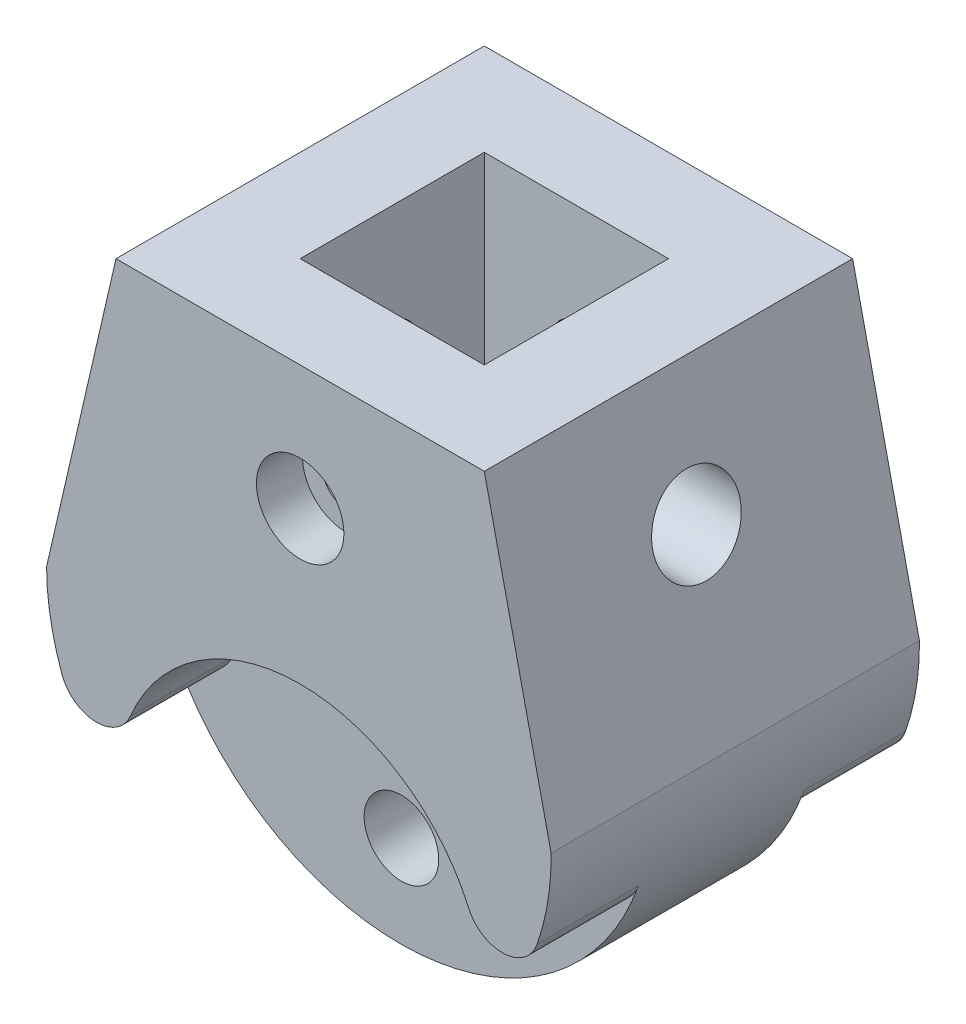
ISO-10303-21;
HEADER;
FILE_DESCRIPTION(('STEP AP214'),'2;1');
FILE_NAME('part.step','',(''),(''),'','','');
FILE_SCHEMA(('AUTOMOTIVE_DESIGN { 1 0 10303 214 1 1 1 1 }'));
ENDSEC;
DATA;
#1=APPLICATION_CONTEXT('core data for automotive mechanical design processes');
#2=APPLICATION_PROTOCOL_DEFINITION('international standard','automotive_design',2000,#1);
#3=PRODUCT_CONTEXT('',#1,'mechanical');
#4=PRODUCT('Part','Part','',(#3));
#5=PRODUCT_RELATED_PRODUCT_CATEGORY('part','',(#4));
#6=PRODUCT_DEFINITION_FORMATION('','',#4);
#7=PRODUCT_DEFINITION_CONTEXT('part definition',#1,'design');
#8=PRODUCT_DEFINITION('design','',#6,#7);
#9=PRODUCT_DEFINITION_SHAPE('','',#8);
#10=(LENGTH_UNIT() NAMED_UNIT(*) SI_UNIT(.MILLI.,.METRE.));
#11=(NAMED_UNIT(*) PLANE_ANGLE_UNIT() SI_UNIT($,.RADIAN.));
#12=(NAMED_UNIT(*) SI_UNIT($,.STERADIAN.) SOLID_ANGLE_UNIT());
#13=UNCERTAINTY_MEASURE_WITH_UNIT(LENGTH_MEASURE(1.E-05),#10,'distance_accuracy_value','');
#14=(GEOMETRIC_REPRESENTATION_CONTEXT(3) GLOBAL_UNCERTAINTY_ASSIGNED_CONTEXT((#13)) GLOBAL_UNIT_ASSIGNED_CONTEXT((#10,
#11,#12)) REPRESENTATION_CONTEXT('',''));
#15=CARTESIAN_POINT('',(0.,0.,0.));
#16=DIRECTION('',(0.,0.,1.));
#17=DIRECTION('',(1.,0.,0.));
#18=AXIS2_PLACEMENT_3D('',#15,#16,#17);
#19=CARTESIAN_POINT('',(-33.7452896286534,36.5,20.));
#20=DIRECTION('',(1.,0.,0.));
#21=DIRECTION('',(0.,0.,-1.));
#22=AXIS2_PLACEMENT_3D('',#19,#20,#21);
#23=CYLINDRICAL_SURFACE('',#22,2.55);
#24=CARTESIAN_POINT('',(-9.99999999999999,36.5,20.));
#25=DIRECTION('',(-1.,0.,0.));
#26=DIRECTION('',(0.,0.,1.));
#27=AXIS2_PLACEMENT_3D('',#24,#25,#26);
#28=CIRCLE('',#27,2.55);
#29=CARTESIAN_POINT('',(-10.,36.5,17.45));
#30=VERTEX_POINT('',#29);
#31=EDGE_CURVE('E354',#30,#30,#28,.T.);
#32=CARTESIAN_POINT('',(-15.540722099948,36.5,20.));
#33=DIRECTION('',(-1.,0.,0.));
#34=DIRECTION('',(0.,0.,1.));
#35=AXIS2_PLACEMENT_3D('',#32,#33,#34);
#36=CIRCLE('',#35,2.55);
#37=CARTESIAN_POINT('',(-15.540722099948,36.5,17.45));
#38=VERTEX_POINT('',#37);
#39=EDGE_CURVE('E368',#38,#38,#36,.F.);
#40=CARTESIAN_POINT('',(-10.,36.5,17.45));
#41=CARTESIAN_POINT('',(-10.0577158552078,36.5,17.45));
#42=CARTESIAN_POINT('',(-10.1154317104156,36.5,17.45));
#43=CARTESIAN_POINT('',(-10.2308634208312,36.5,17.45));
#44=CARTESIAN_POINT('',(-10.288579276039,36.5,17.45));
#45=CARTESIAN_POINT('',(-10.4040109864545,36.5,17.45));
#46=CARTESIAN_POINT('',(-10.4617268416623,36.5,17.45));
#47=CARTESIAN_POINT('',(-10.5771585520779,36.5,17.45));
#48=CARTESIAN_POINT('',(-10.6348744072857,36.5,17.45));
#49=CARTESIAN_POINT('',(-10.7503061177013,36.5,17.45));
#50=CARTESIAN_POINT('',(-10.8080219729091,36.5,17.45));
#51=CARTESIAN_POINT('',(-10.9234536833247,36.5,17.45));
#52=CARTESIAN_POINT('',(-10.9811695385325,36.5,17.45));
#53=CARTESIAN_POINT('',(-11.096601248948,36.5,17.45));
#54=CARTESIAN_POINT('',(-11.1543171041558,36.5,17.45));
#55=CARTESIAN_POINT('',(-11.2697488145714,36.5,17.45));
#56=CARTESIAN_POINT('',(-11.3274646697792,36.5,17.45));
#57=CARTESIAN_POINT('',(-11.4428963801948,36.5,17.45));
#58=CARTESIAN_POINT('',(-11.5006122354026,36.5,17.45));
#59=CARTESIAN_POINT('',(-11.6160439458182,36.5,17.45));
#60=CARTESIAN_POINT('',(-11.673759801026,36.5,17.45));
#61=CARTESIAN_POINT('',(-11.7891915114415,36.5,17.45));
#62=CARTESIAN_POINT('',(-11.8469073666493,36.5,17.45));
#63=CARTESIAN_POINT('',(-11.9623390770649,36.5,17.45));
#64=CARTESIAN_POINT('',(-12.0200549322727,36.5,17.45));
#65=CARTESIAN_POINT('',(-12.1354866426883,36.5,17.45));
#66=CARTESIAN_POINT('',(-12.1932024978961,36.5,17.45));
#67=CARTESIAN_POINT('',(-12.3086342083117,36.5,17.45));
#68=CARTESIAN_POINT('',(-12.3663500635195,36.5,17.45));
#69=CARTESIAN_POINT('',(-12.481781773935,36.5,17.45));
#70=CARTESIAN_POINT('',(-12.5394976291428,36.5,17.45));
#71=CARTESIAN_POINT('',(-12.6549293395584,36.5,17.45));
#72=CARTESIAN_POINT('',(-12.7126451947662,36.5,17.45));
#73=CARTESIAN_POINT('',(-12.8280769051818,36.5,17.45));
#74=CARTESIAN_POINT('',(-12.8857927603896,36.5,17.45));
#75=CARTESIAN_POINT('',(-13.0012244708052,36.5,17.45));
#76=CARTESIAN_POINT('',(-13.058940326013,36.5,17.45));
#77=CARTESIAN_POINT('',(-13.1743720364285,36.5,17.45));
#78=CARTESIAN_POINT('',(-13.2320878916363,36.5,17.45));
#79=CARTESIAN_POINT('',(-13.3475196020519,36.5,17.45));
#80=CARTESIAN_POINT('',(-13.4052354572597,36.5,17.45));
#81=CARTESIAN_POINT('',(-13.5206671676753,36.5,17.45));
#82=CARTESIAN_POINT('',(-13.5783830228831,36.5,17.45));
#83=CARTESIAN_POINT('',(-13.6938147332987,36.5,17.45));
#84=CARTESIAN_POINT('',(-13.7515305885065,36.5,17.45));
#85=CARTESIAN_POINT('',(-13.866962298922,36.5,17.45));
#86=CARTESIAN_POINT('',(-13.9246781541298,36.5,17.45));
#87=CARTESIAN_POINT('',(-14.0401098645454,36.5,17.45));
#88=CARTESIAN_POINT('',(-14.0978257197532,36.5,17.45));
#89=CARTESIAN_POINT('',(-14.2132574301688,36.5,17.45));
#90=CARTESIAN_POINT('',(-14.2709732853766,36.5,17.45));
#91=CARTESIAN_POINT('',(-14.3864049957922,36.5,17.45));
#92=CARTESIAN_POINT('',(-14.444120851,36.5,17.45));
#93=CARTESIAN_POINT('',(-14.5595525614155,36.5,17.45));
#94=CARTESIAN_POINT('',(-14.6172684166233,36.5,17.45));
#95=CARTESIAN_POINT('',(-14.7327001270389,36.5,17.45));
#96=CARTESIAN_POINT('',(-14.7904159822467,36.5,17.45));
#97=CARTESIAN_POINT('',(-14.9058476926623,36.5,17.45));
#98=CARTESIAN_POINT('',(-14.9635635478701,36.5,17.45));
#99=CARTESIAN_POINT('',(-15.0789952582857,36.5,17.45));
#100=CARTESIAN_POINT('',(-15.1367111134935,36.5,17.45));
#101=CARTESIAN_POINT('',(-15.252142823909,36.5,17.45));
#102=CARTESIAN_POINT('',(-15.3098586791168,36.5,17.45));
#103=CARTESIAN_POINT('',(-15.4252903895324,36.5,17.45));
#104=CARTESIAN_POINT('',(-15.4830062447402,36.5,17.45));
#105=CARTESIAN_POINT('',(-15.540722099948,36.5,17.45));
#106=B_SPLINE_CURVE_WITH_KNOTS('',3,(#40,#41,#42,#43,#44,#45,#46,#47,#48,#49,#50,#51,#52,#53,
#54,#55,#56,#57,#58,#59,#60,#61,#62,#63,#64,#65,#66,#67,#68,#69,#70,#71,#72,#73,#74,#75,#76,#77,
#78,#79,#80,#81,#82,#83,#84,#85,#86,#87,#88,#89,#90,#91,#92,#93,#94,#95,#96,#97,#98,#99,#100,
#101,#102,#103,#104,#105),.UNSPECIFIED.,.F.,.F.,(4,2,2,2,2,2,2,2,2,2,2,2,2,2,2,2,2,2,2,2,2,2,2,
2,2,2,2,2,2,2,2,2,4),(0.,0.173147565623376,0.346295131246749,0.519442696870126,
0.692590262493499,0.865737828116875,1.03888539374025,1.21203295936362,1.385180524987,
1.55832809061037,1.73147565623375,1.90462322185712,2.0777707874805,2.25091835310387,
2.42406591872725,2.59721348435062,2.770361049974,2.94350861559738,3.11665618122075,
3.28980374684413,3.4629513124675,3.63609887809088,3.80924644371425,3.98239400933762,
4.155541574961,4.32868914058437,4.50183670620775,4.67498427183112,4.8481318374545,
5.02127940307787,5.19442696870125,5.36757453432463,5.540722099948),.UNSPECIFIED.);
#107=EDGE_CURVE('BSEAM69',#30,#38,#106,.T.);
#108=ORIENTED_EDGE('',*,*,#31,.F.);
#109=ORIENTED_EDGE('',*,*,#39,.F.);
#110=ORIENTED_EDGE('',*,*,#107,.T.);
#111=ORIENTED_EDGE('',*,*,#107,.F.);
#112=EDGE_LOOP('',(#108,#110,#109,#111));
#113=FACE_BOUND('',#112,.T.);
#114=ADVANCED_FACE('F69',(#113),#23,.F.);
#115=CARTESIAN_POINT('',(10.,36.5,20.));
#116=DIRECTION('',(1.,0.,0.));
#117=DIRECTION('',(0.,0.,-1.));
#118=AXIS2_PLACEMENT_3D('',#115,#116,#117);
#119=CIRCLE('',#118,2.55);
#120=CARTESIAN_POINT('',(10.,36.5,17.45));
#121=VERTEX_POINT('',#120);
#122=EDGE_CURVE('E358',#121,#121,#119,.T.);
#123=CARTESIAN_POINT('',(15.2547103713466,36.5,20.));
#124=DIRECTION('',(1.,0.,0.));
#125=DIRECTION('',(0.,0.,-1.));
#126=AXIS2_PLACEMENT_3D('',#123,#124,#125);
#127=CIRCLE('',#126,2.55);
#128=CARTESIAN_POINT('',(15.2547103713466,36.5,17.45));
#129=VERTEX_POINT('',#128);
#130=EDGE_CURVE('E360',#129,#129,#127,.F.);
#131=CARTESIAN_POINT('',(10.,36.5,17.45));
#132=CARTESIAN_POINT('',(10.0547365663682,36.5,17.45));
#133=CARTESIAN_POINT('',(10.1094731327364,36.5,17.45));
#134=CARTESIAN_POINT('',(10.2189462654728,36.5,17.45));
#135=CARTESIAN_POINT('',(10.273682831841,36.5,17.45));
#136=CARTESIAN_POINT('',(10.3831559645774,36.5,17.45));
#137=CARTESIAN_POINT('',(10.4378925309456,36.5,17.45));
#138=CARTESIAN_POINT('',(10.5473656636819,36.5,17.45));
#139=CARTESIAN_POINT('',(10.6021022300501,36.5,17.45));
#140=CARTESIAN_POINT('',(10.7115753627865,36.5,17.45));
#141=CARTESIAN_POINT('',(10.7663119291547,36.5,17.45));
#142=CARTESIAN_POINT('',(10.8757850618911,36.5,17.45));
#143=CARTESIAN_POINT('',(10.9305216282593,36.5,17.45));
#144=CARTESIAN_POINT('',(11.0399947609957,36.5,17.45));
#145=CARTESIAN_POINT('',(11.0947313273639,36.5,17.45));
#146=CARTESIAN_POINT('',(11.2042044601003,36.5,17.45));
#147=CARTESIAN_POINT('',(11.2589410264685,36.5,17.45));
#148=CARTESIAN_POINT('',(11.3684141592049,36.5,17.45));
#149=CARTESIAN_POINT('',(11.423150725573,36.5,17.45));
#150=CARTESIAN_POINT('',(11.5326238583094,36.5,17.45));
#151=CARTESIAN_POINT('',(11.5873604246776,36.5,17.45));
#152=CARTESIAN_POINT('',(11.696833557414,36.5,17.45));
#153=CARTESIAN_POINT('',(11.7515701237822,36.5,17.45));
#154=CARTESIAN_POINT('',(11.8610432565186,36.5,17.45));
#155=CARTESIAN_POINT('',(11.9157798228868,36.5,17.45));
#156=CARTESIAN_POINT('',(12.0252529556232,36.5,17.45));
#157=CARTESIAN_POINT('',(12.0799895219914,36.5,17.45));
#158=CARTESIAN_POINT('',(12.1894626547278,36.5,17.45));
#159=CARTESIAN_POINT('',(12.244199221096,36.5,17.45));
#160=CARTESIAN_POINT('',(12.3536723538323,36.5,17.45));
#161=CARTESIAN_POINT('',(12.4084089202005,36.5,17.45));
#162=CARTESIAN_POINT('',(12.5178820529369,36.5,17.45));
#163=CARTESIAN_POINT('',(12.5726186193051,36.5,17.45));
#164=CARTESIAN_POINT('',(12.6820917520415,36.5,17.45));
#165=CARTESIAN_POINT('',(12.7368283184097,36.5,17.45));
#166=CARTESIAN_POINT('',(12.8463014511461,36.5,17.45));
#167=CARTESIAN_POINT('',(12.9010380175143,36.5,17.45));
#168=CARTESIAN_POINT('',(13.0105111502507,36.5,17.45));
#169=CARTESIAN_POINT('',(13.0652477166189,36.5,17.45));
#170=CARTESIAN_POINT('',(13.1747208493553,36.5,17.45));
#171=CARTESIAN_POINT('',(13.2294574157235,36.5,17.45));
#172=CARTESIAN_POINT('',(13.3389305484598,36.5,17.45));
#173=CARTESIAN_POINT('',(13.393667114828,36.5,17.45));
#174=CARTESIAN_POINT('',(13.5031402475644,36.5,17.45));
#175=CARTESIAN_POINT('',(13.5578768139326,36.5,17.45));
#176=CARTESIAN_POINT('',(13.667349946669,36.5,17.45));
#177=CARTESIAN_POINT('',(13.7220865130372,36.5,17.45));
#178=CARTESIAN_POINT('',(13.8315596457736,36.5,17.45));
#179=CARTESIAN_POINT('',(13.8862962121418,36.5,17.45));
#180=CARTESIAN_POINT('',(13.9957693448782,36.5,17.45));
#181=CARTESIAN_POINT('',(14.0505059112464,36.5,17.45));
#182=CARTESIAN_POINT('',(14.1599790439828,36.5,17.45));
#183=CARTESIAN_POINT('',(14.2147156103509,36.5,17.45));
#184=CARTESIAN_POINT('',(14.3241887430873,36.5,17.45));
#185=CARTESIAN_POINT('',(14.3789253094555,36.5,17.45));
#186=CARTESIAN_POINT('',(14.4883984421919,36.5,17.45));
#187=CARTESIAN_POINT('',(14.5431350085601,36.5,17.45));
#188=CARTESIAN_POINT('',(14.6526081412965,36.5,17.45));
#189=CARTESIAN_POINT('',(14.7073447076647,36.5,17.45));
#190=CARTESIAN_POINT('',(14.8168178404011,36.5,17.45));
#191=CARTESIAN_POINT('',(14.8715544067693,36.5,17.45));
#192=CARTESIAN_POINT('',(14.9810275395057,36.5,17.45));
#193=CARTESIAN_POINT('',(15.0357641058739,36.5,17.45));
#194=CARTESIAN_POINT('',(15.1452372386102,36.5,17.45));
#195=CARTESIAN_POINT('',(15.1999738049784,36.5,17.45));
#196=CARTESIAN_POINT('',(15.2547103713466,36.5,17.45));
#197=B_SPLINE_CURVE_WITH_KNOTS('',3,(#131,#132,#133,#134,#135,#136,#137,#138,#139,#140,#141,
#142,#143,#144,#145,#146,#147,#148,#149,#150,#151,#152,#153,#154,#155,#156,#157,#158,#159,#160,
#161,#162,#163,#164,#165,#166,#167,#168,#169,#170,#171,#172,#173,#174,#175,#176,#177,#178,#179,
#180,#181,#182,#183,#184,#185,#186,#187,#188,#189,#190,#191,#192,#193,#194,#195,#196),
.UNSPECIFIED.,.F.,.F.,(4,2,2,2,2,2,2,2,2,2,2,2,2,2,2,2,2,2,2,2,2,2,2,2,2,2,2,2,2,2,2,2,4),(0.,
0.164209699104585,0.328419398209163,0.492629097313749,0.656838796418327,0.821048495522912,
0.985258194627491,1.14946789373208,1.31367759283665,1.47788729194124,1.64209699104582,
1.8063066901504,1.97051638925499,2.13472608835957,2.29893578746415,2.46314548656873,
2.62735518567332,2.7915648847779,2.95577458388248,3.11998428298706,3.28419398209164,
3.44840368119623,3.61261338030081,3.77682307940539,3.94103277850998,4.10524247761455,
4.26945217671914,4.43366187582372,4.5978715749283,4.76208127403288,4.92629097313747,
5.09050067224205,5.25471037134663),.UNSPECIFIED.);
#198=EDGE_CURVE('BSEAM486',#121,#129,#197,.T.);
#199=ORIENTED_EDGE('',*,*,#122,.F.);
#200=ORIENTED_EDGE('',*,*,#130,.F.);
#201=ORIENTED_EDGE('',*,*,#198,.T.);
#202=ORIENTED_EDGE('',*,*,#198,.F.);
#203=EDGE_LOOP('',(#199,#201,#200,#202));
#204=FACE_BOUND('',#203,.T.);
#205=ADVANCED_FACE('F486',(#204),#23,.F.);
#206=CARTESIAN_POINT('',(0.,36.5,-7.));
#207=DIRECTION('',(0.,0.,1.));
#208=DIRECTION('',(1.,0.,0.));
#209=AXIS2_PLACEMENT_3D('',#206,#207,#208);
#210=CYLINDRICAL_SURFACE('',#209,2.55);
#211=CARTESIAN_POINT('',(0.,36.5,10.));
#212=DIRECTION('',(0.,0.,-1.));
#213=DIRECTION('',(-1.,0.,0.));
#214=AXIS2_PLACEMENT_3D('',#211,#212,#213);
#215=CIRCLE('',#214,2.55);
#216=CARTESIAN_POINT('',(-2.54999999999999,36.5,10.));
#217=VERTEX_POINT('',#216);
#218=EDGE_CURVE('E339',#217,#217,#215,.T.);
#219=ORIENTED_EDGE('',*,*,#218,.F.);
#220=EDGE_LOOP('',(#219));
#221=FACE_BOUND('',#220,.T.);
#222=CARTESIAN_POINT('',(0.,36.5,5.));
#223=DIRECTION('',(0.,0.,-1.));
#224=DIRECTION('',(-1.,0.,0.));
#225=AXIS2_PLACEMENT_3D('',#222,#223,#224);
#226=CIRCLE('',#225,2.55);
#227=CARTESIAN_POINT('',(-2.54999999999999,36.5,5.));
#228=VERTEX_POINT('',#227);
#229=EDGE_CURVE('E348',#228,#228,#226,.F.);
#230=ORIENTED_EDGE('',*,*,#229,.F.);
#231=EDGE_LOOP('',(#230));
#232=FACE_BOUND('',#231,.T.);
#233=ADVANCED_FACE('F492',(#221,#232),#210,.F.);
#234=CARTESIAN_POINT('',(0.,36.5,30.));
#235=DIRECTION('',(0.,0.,1.));
#236=DIRECTION('',(1.,0.,0.));
#237=AXIS2_PLACEMENT_3D('',#234,#235,#236);
#238=CIRCLE('',#237,2.55);
#239=CARTESIAN_POINT('',(2.55,36.5,30.));
#240=VERTEX_POINT('',#239);
#241=EDGE_CURVE('E225',#240,#240,#238,.T.);
#242=ORIENTED_EDGE('',*,*,#241,.F.);
#243=EDGE_LOOP('',(#242));
#244=FACE_BOUND('',#243,.T.);
#245=CARTESIAN_POINT('',(0.,36.5,35.));
#246=DIRECTION('',(0.,0.,1.));
#247=DIRECTION('',(1.,0.,0.));
#248=AXIS2_PLACEMENT_3D('',#245,#246,#247);
#249=CIRCLE('',#248,2.55);
#250=CARTESIAN_POINT('',(2.55,36.5,35.));
#251=VERTEX_POINT('',#250);
#252=EDGE_CURVE('E343',#251,#251,#249,.F.);
#253=ORIENTED_EDGE('',*,*,#252,.F.);
#254=EDGE_LOOP('',(#253));
#255=FACE_BOUND('',#254,.T.);
#256=ADVANCED_FACE('F518',(#244,#255),#210,.F.);
#257=CARTESIAN_POINT('',(0.,0.,0.));
#258=DIRECTION('',(0.,0.,1.));
#259=DIRECTION('',(1.,0.,0.));
#260=AXIS2_PLACEMENT_3D('',#257,#258,#259);
#261=CYLINDRICAL_SURFACE('',#260,4.05);
#262=CARTESIAN_POINT('',(0.,0.,29.));
#263=DIRECTION('',(0.,0.,1.));
#264=DIRECTION('',(1.,0.,0.));
#265=AXIS2_PLACEMENT_3D('',#262,#263,#264);
#266=CIRCLE('',#265,4.05);
#267=CARTESIAN_POINT('',(4.05,0.,29.));
#268=VERTEX_POINT('',#267);
#269=EDGE_CURVE('E267',#268,#268,#266,.F.);
#270=ORIENTED_EDGE('',*,*,#269,.F.);
#271=EDGE_LOOP('',(#270));
#272=FACE_BOUND('',#271,.T.);
#273=CARTESIAN_POINT('',(0.,0.,11.));
#274=DIRECTION('',(0.,0.,-1.));
#275=DIRECTION('',(-1.,0.,0.));
#276=AXIS2_PLACEMENT_3D('',#273,#274,#275);
#277=CIRCLE('',#276,4.05);
#278=CARTESIAN_POINT('',(-4.05,0.,11.));
#279=VERTEX_POINT('',#278);
#280=EDGE_CURVE('E258',#279,#279,#277,.F.);
#281=ORIENTED_EDGE('',*,*,#280,.F.);
#282=EDGE_LOOP('',(#281));
#283=FACE_BOUND('',#282,.T.);
#284=ADVANCED_FACE('F544',(#272,#283),#261,.F.);
#285=CARTESIAN_POINT('',(-0.142520981617814,17.3985629305255,40.));
#286=DIRECTION('',(0.,0.,-1.));
#287=DIRECTION('',(-1.,0.,0.));
#288=AXIS2_PLACEMENT_3D('',#285,#286,#287);
#289=CYLINDRICAL_SURFACE('',#288,27.3989336085944);
#290=CARTESIAN_POINT('',(-0.142520981617814,17.3985629305255,40.));
#291=DIRECTION('',(0.,0.,1.));
#292=DIRECTION('',(1.,0.,0.));
#293=AXIS2_PLACEMENT_3D('',#290,#291,#292);
#294=CIRCLE('',#293,27.3989336085944);
#295=CARTESIAN_POINT('',(27.2547103713467,17.7039758973517,40.));
#296=VERTEX_POINT('',#295);
#297=CARTESIAN_POINT('',(25.7303465984383,8.38211761803965,40.));
#298=VERTEX_POINT('',#297);
#299=EDGE_CURVE('E279',#296,#298,#294,.F.);
#300=ORIENTED_EDGE('',*,*,#299,.T.);
#301=DIRECTION('',(0.,0.,-1.));
#302=VECTOR('',#301,1.);
#303=CARTESIAN_POINT('',(25.7303465984383,8.38211761803965,40.));
#304=LINE('',#303,#302);
#305=CARTESIAN_POINT('',(25.7303465984383,8.38211761803965,29.));
#306=VERTEX_POINT('',#305);
#307=EDGE_CURVE('E392',#298,#306,#304,.T.);
#308=ORIENTED_EDGE('',*,*,#307,.T.);
#309=CARTESIAN_POINT('',(-0.142520981617814,17.3985629305255,29.));
#310=DIRECTION('',(0.,0.,1.));
#311=DIRECTION('',(1.,0.,0.));
#312=AXIS2_PLACEMENT_3D('',#309,#310,#311);
#313=CIRCLE('',#312,27.3989336085944);
#314=CARTESIAN_POINT('',(1.29797973584533E-12,-10.,29.));
#315=VERTEX_POINT('',#314);
#316=EDGE_CURVE('E274',#306,#315,#313,.F.);
#317=ORIENTED_EDGE('',*,*,#316,.T.);
#318=DIRECTION('',(0.,0.,-1.));
#319=VECTOR('',#318,1.);
#320=CARTESIAN_POINT('',(1.29797973584533E-12,-10.,40.));
#321=LINE('',#320,#319);
#322=CARTESIAN_POINT('',(1.29797973584533E-12,-10.,11.));
#323=VERTEX_POINT('',#322);
#324=EDGE_CURVE('E299',#315,#323,#321,.T.);
#325=ORIENTED_EDGE('',*,*,#324,.T.);
#326=CARTESIAN_POINT('',(-0.142520981617814,17.3985629305255,11.));
#327=DIRECTION('',(0.,0.,-1.));
#328=DIRECTION('',(-1.,0.,0.));
#329=AXIS2_PLACEMENT_3D('',#326,#327,#328);
#330=CIRCLE('',#329,27.3989336085944);
#331=CARTESIAN_POINT('',(25.7303465984383,8.38211761803965,11.));
#332=VERTEX_POINT('',#331);
#333=EDGE_CURVE('E253',#323,#332,#330,.F.);
#334=ORIENTED_EDGE('',*,*,#333,.T.);
#335=DIRECTION('',(0.,0.,-1.));
#336=VECTOR('',#335,1.);
#337=CARTESIAN_POINT('',(25.7303465984383,8.38211761803965,40.));
#338=LINE('',#337,#336);
#339=CARTESIAN_POINT('',(25.7303465984383,8.38211761803965,0.));
#340=VERTEX_POINT('',#339);
#341=EDGE_CURVE('E389',#332,#340,#338,.T.);
#342=ORIENTED_EDGE('',*,*,#341,.T.);
#343=CARTESIAN_POINT('',(-0.142520981617814,17.3985629305255,0.));
#344=DIRECTION('',(0.,0.,1.));
#345=DIRECTION('',(1.,0.,0.));
#346=AXIS2_PLACEMENT_3D('',#343,#344,#345);
#347=CIRCLE('',#346,27.3989336085944);
#348=CARTESIAN_POINT('',(27.2547103713467,17.7039758973517,0.));
#349=VERTEX_POINT('',#348);
#350=EDGE_CURVE('E278',#349,#340,#347,.F.);
#351=ORIENTED_EDGE('',*,*,#350,.F.);
#352=DIRECTION('',(0.,0.,-1.));
#353=VECTOR('',#352,1.);
#354=CARTESIAN_POINT('',(27.2547103713467,17.7039758973517,40.));
#355=LINE('',#354,#353);
#356=EDGE_CURVE('E329',#296,#349,#355,.T.);
#357=ORIENTED_EDGE('',*,*,#356,.F.);
#358=EDGE_LOOP('',(#300,#308,#317,#325,#334,#342,#351,#357));
#359=FACE_BOUND('',#358,.T.);
#360=ADVANCED_FACE('F454',(#359),#289,.T.);
#361=CARTESIAN_POINT('',(0.,0.,0.));
#362=DIRECTION('',(0.,0.,1.));
#363=DIRECTION('',(1.,0.,0.));
#364=AXIS2_PLACEMENT_3D('',#361,#362,#363);
#365=PLANE('',#364);
#366=CARTESIAN_POINT('',(0.,36.5,0.));
#367=DIRECTION('',(0.,0.,-1.));
#368=DIRECTION('',(-1.,0.,0.));
#369=AXIS2_PLACEMENT_3D('',#366,#367,#368);
#370=CIRCLE('',#369,4.75);
#371=CARTESIAN_POINT('',(-4.74999999999999,36.5,0.));
#372=VERTEX_POINT('',#371);
#373=EDGE_CURVE('E804',#372,#372,#370,.T.);
#374=ORIENTED_EDGE('',*,*,#373,.F.);
#375=EDGE_LOOP('',(#374));
#376=FACE_BOUND('',#375,.T.);
#377=CARTESIAN_POINT('',(0.,0.,0.));
#378=DIRECTION('',(0.,0.,-1.));
#379=DIRECTION('',(-1.,0.,0.));
#380=AXIS2_PLACEMENT_3D('',#377,#378,#379);
#381=CIRCLE('',#380,20.);
#382=CARTESIAN_POINT('',(-18.4241139627925,7.781518147896,0.));
#383=VERTEX_POINT('',#382);
#384=CARTESIAN_POINT('',(18.2942821926664,8.08203186427083,0.));
#385=VERTEX_POINT('',#384);
#386=EDGE_CURVE('E243',#383,#385,#381,.T.);
#387=ORIENTED_EDGE('',*,*,#386,.F.);
#388=CARTESIAN_POINT('',(-22.108936755351,9.3378217774752,0.));
#389=DIRECTION('',(0.,0.,1.));
#390=DIRECTION('',(1.,0.,0.));
#391=AXIS2_PLACEMENT_3D('',#388,#389,#390);
#392=CIRCLE('',#391,4.);
#393=CARTESIAN_POINT('',(-25.8641088374837,7.95989484415435,0.));
#394=VERTEX_POINT('',#393);
#395=EDGE_CURVE('E412',#383,#394,#392,.F.);
#396=ORIENTED_EDGE('',*,*,#395,.T.);
#397=CARTESIAN_POINT('',(-0.142519109293932,17.3982029906541,0.));
#398=DIRECTION('',(0.,0.,1.));
#399=DIRECTION('',(1.,0.,0.));
#400=AXIS2_PLACEMENT_3D('',#397,#398,#399);
#401=CIRCLE('',#400,27.3985736638534);
#402=CARTESIAN_POINT('',(-27.540722099948,17.2556838813602,0.));
#403=VERTEX_POINT('',#402);
#404=EDGE_CURVE('E284',#403,#394,#401,.T.);
#405=ORIENTED_EDGE('',*,*,#404,.F.);
#406=DIRECTION('',(0.224417036844025,0.974493198321131,0.));
#407=VECTOR('',#406,1.);
#408=CARTESIAN_POINT('',(-29.9273836710772,6.89200784113033,0.));
#409=LINE('',#408,#407);
#410=CARTESIAN_POINT('',(-20.,50.,0.));
#411=VERTEX_POINT('',#410);
#412=EDGE_CURVE('E310',#403,#411,#409,.T.);
#413=ORIENTED_EDGE('',*,*,#412,.T.);
#414=DIRECTION('',(1.,0.,0.));
#415=VECTOR('',#414,1.);
#416=CARTESIAN_POINT('',(0.,50.,0.));
#417=LINE('',#416,#415);
#418=CARTESIAN_POINT('',(20.,50.,0.));
#419=VERTEX_POINT('',#418);
#420=EDGE_CURVE('E306',#411,#419,#417,.T.);
#421=ORIENTED_EDGE('',*,*,#420,.T.);
#422=DIRECTION('',(-0.219170139259048,0.975686655672388,0.));
#423=VECTOR('',#422,1.);
#424=CARTESIAN_POINT('',(29.731358010989,6.67860510107978,0.));
#425=LINE('',#424,#423);
#426=EDGE_CURVE('E302',#349,#419,#425,.T.);
#427=ORIENTED_EDGE('',*,*,#426,.F.);
#428=ORIENTED_EDGE('',*,*,#350,.T.);
#429=CARTESIAN_POINT('',(21.9531386311997,9.69843823712499,0.));
#430=DIRECTION('',(0.,0.,1.));
#431=DIRECTION('',(1.,0.,0.));
#432=AXIS2_PLACEMENT_3D('',#429,#430,#431);
#433=CIRCLE('',#432,4.);
#434=EDGE_CURVE('E85',#340,#385,#433,.F.);
#435=ORIENTED_EDGE('',*,*,#434,.T.);
#436=EDGE_LOOP('',(#387,#396,#405,#413,#421,#427,#428,#435));
#437=FACE_BOUND('',#436,.T.);
#438=ADVANCED_FACE('F434',(#376,#437),#365,.F.);
#439=CARTESIAN_POINT('',(-0.142519109293932,17.3982029906541,40.));
#440=DIRECTION('',(0.,0.,-1.));
#441=DIRECTION('',(-1.,0.,0.));
#442=AXIS2_PLACEMENT_3D('',#439,#440,#441);
#443=CYLINDRICAL_SURFACE('',#442,27.3985736638534);
#444=CARTESIAN_POINT('',(-0.142519109293932,17.3982029906541,29.));
#445=DIRECTION('',(0.,0.,1.));
#446=DIRECTION('',(1.,0.,0.));
#447=AXIS2_PLACEMENT_3D('',#444,#445,#446);
#448=CIRCLE('',#447,27.3985736638534);
#449=CARTESIAN_POINT('',(-25.8641088374837,7.95989484415435,29.));
#450=VERTEX_POINT('',#449);
#451=EDGE_CURVE('E271',#450,#315,#448,.T.);
#452=ORIENTED_EDGE('',*,*,#451,.F.);
#453=DIRECTION('',(0.,0.,-1.));
#454=VECTOR('',#453,1.);
#455=CARTESIAN_POINT('',(-25.8641088374837,7.95989484415435,40.));
#456=LINE('',#455,#454);
#457=CARTESIAN_POINT('',(-25.8641088374837,7.95989484415435,40.));
#458=VERTEX_POINT('',#457);
#459=EDGE_CURVE('E400',#450,#458,#456,.F.);
#460=ORIENTED_EDGE('',*,*,#459,.T.);
#461=CARTESIAN_POINT('',(-0.142519109293932,17.3982029906541,40.));
#462=DIRECTION('',(0.,0.,1.));
#463=DIRECTION('',(1.,0.,0.));
#464=AXIS2_PLACEMENT_3D('',#461,#462,#463);
#465=CIRCLE('',#464,27.3985736638534);
#466=CARTESIAN_POINT('',(-27.540722099948,17.2556838813602,40.));
#467=VERTEX_POINT('',#466);
#468=EDGE_CURVE('E295',#467,#458,#465,.T.);
#469=ORIENTED_EDGE('',*,*,#468,.F.);
#470=DIRECTION('',(0.,0.,-1.));
#471=VECTOR('',#470,1.);
#472=CARTESIAN_POINT('',(-27.540722099948,17.2556838813602,40.));
#473=LINE('',#472,#471);
#474=EDGE_CURVE('E320',#467,#403,#473,.T.);
#475=ORIENTED_EDGE('',*,*,#474,.T.);
#476=ORIENTED_EDGE('',*,*,#404,.T.);
#477=DIRECTION('',(0.,0.,-1.));
#478=VECTOR('',#477,1.);
#479=CARTESIAN_POINT('',(-25.8641088374837,7.95989484415435,40.));
#480=LINE('',#479,#478);
#481=CARTESIAN_POINT('',(-25.8641088374837,7.95989484415435,11.));
#482=VERTEX_POINT('',#481);
#483=EDGE_CURVE('E396',#394,#482,#480,.F.);
#484=ORIENTED_EDGE('',*,*,#483,.T.);
#485=CARTESIAN_POINT('',(-0.142519109293932,17.3982029906541,11.));
#486=DIRECTION('',(0.,0.,-1.));
#487=DIRECTION('',(-1.,0.,0.));
#488=AXIS2_PLACEMENT_3D('',#485,#486,#487);
#489=CIRCLE('',#488,27.3985736638534);
#490=EDGE_CURVE('E332',#323,#482,#489,.T.);
#491=ORIENTED_EDGE('',*,*,#490,.F.);
#492=ORIENTED_EDGE('',*,*,#324,.F.);
#493=EDGE_LOOP('',(#452,#460,#469,#475,#476,#484,#491,#492));
#494=FACE_BOUND('',#493,.T.);
#495=ADVANCED_FACE('F437',(#494),#443,.T.);
#496=CARTESIAN_POINT('',(-29.9273836710772,6.89200784113033,40.));
#497=DIRECTION('',(-0.974493198321131,0.224417036844025,0.));
#498=DIRECTION('',(-0.224417036844025,-0.974493198321131,0.));
#499=AXIS2_PLACEMENT_3D('',#496,#497,#498);
#500=PLANE('',#499);
#501=CARTESIAN_POINT('',(-23.1089288284555,36.5,20.));
#502=DIRECTION('',(-0.974493198321131,0.224417036844025,0.));
#503=DIRECTION('',(-0.224417036844025,-0.974493198321131,0.));
#504=AXIS2_PLACEMENT_3D('',#501,#502,#503);
#505=ELLIPSE('',#504,4.874328531162,4.75);
#506=CARTESIAN_POINT('',(-24.2028111940231,31.75,20.));
#507=VERTEX_POINT('',#506);
#508=EDGE_CURVE('E372',#507,#507,#505,.T.);
#509=ORIENTED_EDGE('',*,*,#508,.F.);
#510=EDGE_LOOP('',(#509));
#511=FACE_BOUND('',#510,.T.);
#512=ORIENTED_EDGE('',*,*,#412,.F.);
#513=ORIENTED_EDGE('',*,*,#474,.F.);
#514=DIRECTION('',(0.224417036844025,0.974493198321131,0.));
#515=VECTOR('',#514,1.);
#516=CARTESIAN_POINT('',(-29.9273836710772,6.89200784113033,40.));
#517=LINE('',#516,#515);
#518=CARTESIAN_POINT('',(-20.,50.,40.));
#519=VERTEX_POINT('',#518);
#520=EDGE_CURVE('E291',#467,#519,#517,.T.);
#521=ORIENTED_EDGE('',*,*,#520,.T.);
#522=DIRECTION('',(0.,0.,-1.));
#523=VECTOR('',#522,1.);
#524=CARTESIAN_POINT('',(-20.,50.,40.));
#525=LINE('',#524,#523);
#526=EDGE_CURVE('E323',#519,#411,#525,.T.);
#527=ORIENTED_EDGE('',*,*,#526,.T.);
#528=EDGE_LOOP('',(#512,#513,#521,#527));
#529=FACE_BOUND('',#528,.T.);
#530=ADVANCED_FACE('F441',(#511,#529),#500,.T.);
#531=CARTESIAN_POINT('',(0.,50.,40.));
#532=DIRECTION('',(0.,1.,0.));
#533=DIRECTION('',(0.,0.,1.));
#534=AXIS2_PLACEMENT_3D('',#531,#532,#533);
#535=PLANE('',#534);
#536=DIRECTION('',(0.,0.,-1.));
#537=VECTOR('',#536,1.);
#538=CARTESIAN_POINT('',(10.,50.,10.));
#539=LINE('',#538,#537);
#540=CARTESIAN_POINT('',(10.,50.,30.));
#541=VERTEX_POINT('',#540);
#542=CARTESIAN_POINT('',(10.,50.,10.));
#543=VERTEX_POINT('',#542);
#544=EDGE_CURVE('E198',#541,#543,#539,.T.);
#545=ORIENTED_EDGE('',*,*,#544,.F.);
#546=DIRECTION('',(1.,0.,0.));
#547=VECTOR('',#546,1.);
#548=CARTESIAN_POINT('',(-9.99999999999999,50.,30.));
#549=LINE('',#548,#547);
#550=CARTESIAN_POINT('',(-9.99999999999999,50.,30.));
#551=VERTEX_POINT('',#550);
#552=EDGE_CURVE('E218',#551,#541,#549,.T.);
#553=ORIENTED_EDGE('',*,*,#552,.F.);
#554=DIRECTION('',(0.,0.,1.));
#555=VECTOR('',#554,1.);
#556=CARTESIAN_POINT('',(-10.,50.,10.));
#557=LINE('',#556,#555);
#558=CARTESIAN_POINT('',(-10.,50.,10.));
#559=VERTEX_POINT('',#558);
#560=EDGE_CURVE('E222',#559,#551,#557,.T.);
#561=ORIENTED_EDGE('',*,*,#560,.F.);
#562=DIRECTION('',(-1.,0.,0.));
#563=VECTOR('',#562,1.);
#564=CARTESIAN_POINT('',(-10.,50.,10.));
#565=LINE('',#564,#563);
#566=EDGE_CURVE('E234',#543,#559,#565,.T.);
#567=ORIENTED_EDGE('',*,*,#566,.F.);
#568=EDGE_LOOP('',(#545,#553,#561,#567));
#569=FACE_BOUND('',#568,.T.);
#570=ORIENTED_EDGE('',*,*,#420,.F.);
#571=ORIENTED_EDGE('',*,*,#526,.F.);
#572=DIRECTION('',(1.,0.,0.));
#573=VECTOR('',#572,1.);
#574=CARTESIAN_POINT('',(0.,50.,40.));
#575=LINE('',#574,#573);
#576=CARTESIAN_POINT('',(20.,50.,40.));
#577=VERTEX_POINT('',#576);
#578=EDGE_CURVE('E287',#519,#577,#575,.T.);
#579=ORIENTED_EDGE('',*,*,#578,.T.);
#580=DIRECTION('',(0.,0.,-1.));
#581=VECTOR('',#580,1.);
#582=CARTESIAN_POINT('',(20.,50.,40.));
#583=LINE('',#582,#581);
#584=EDGE_CURVE('E326',#577,#419,#583,.T.);
#585=ORIENTED_EDGE('',*,*,#584,.T.);
#586=EDGE_LOOP('',(#570,#571,#579,#585));
#587=FACE_BOUND('',#586,.T.);
#588=ADVANCED_FACE('F446',(#569,#587),#535,.T.);
#589=CARTESIAN_POINT('',(29.731358010989,6.67860510107978,40.));
#590=DIRECTION('',(-0.975686655672388,-0.219170139259048,0.));
#591=DIRECTION('',(0.219170139259048,-0.975686655672388,0.));
#592=AXIS2_PLACEMENT_3D('',#589,#590,#591);
#593=PLANE('',#592);
#594=CARTESIAN_POINT('',(23.0325277718984,36.5,20.));
#595=DIRECTION('',(-0.975686655672388,-0.219170139259048,0.));
#596=DIRECTION('',(0.219170139259048,-0.975686655672388,0.));
#597=AXIS2_PLACEMENT_3D('',#594,#595,#596);
#598=ELLIPSE('',#597,4.8683662653217,4.75);
#599=CARTESIAN_POINT('',(24.099528284233,31.75,20.));
#600=VERTEX_POINT('',#599);
#601=EDGE_CURVE('E359',#600,#600,#598,.T.);
#602=ORIENTED_EDGE('',*,*,#601,.T.);
#603=EDGE_LOOP('',(#602));
#604=FACE_BOUND('',#603,.T.);
#605=ORIENTED_EDGE('',*,*,#426,.T.);
#606=ORIENTED_EDGE('',*,*,#584,.F.);
#607=DIRECTION('',(-0.219170139259048,0.975686655672388,0.));
#608=VECTOR('',#607,1.);
#609=CARTESIAN_POINT('',(29.731358010989,6.67860510107978,40.));
#610=LINE('',#609,#608);
#611=EDGE_CURVE('E283',#296,#577,#610,.T.);
#612=ORIENTED_EDGE('',*,*,#611,.F.);
#613=ORIENTED_EDGE('',*,*,#356,.T.);
#614=EDGE_LOOP('',(#605,#606,#612,#613));
#615=FACE_BOUND('',#614,.T.);
#616=ADVANCED_FACE('F451',(#604,#615),#593,.F.);
#617=CARTESIAN_POINT('',(0.,0.,40.));
#618=DIRECTION('',(0.,0.,1.));
#619=DIRECTION('',(1.,0.,0.));
#620=AXIS2_PLACEMENT_3D('',#617,#618,#619);
#621=PLANE('',#620);
#622=CARTESIAN_POINT('',(0.,36.5,40.));
#623=DIRECTION('',(0.,0.,1.));
#624=DIRECTION('',(1.,0.,0.));
#625=AXIS2_PLACEMENT_3D('',#622,#623,#624);
#626=CIRCLE('',#625,4.75);
#627=CARTESIAN_POINT('',(4.75,36.5,40.));
#628=VERTEX_POINT('',#627);
#629=EDGE_CURVE('E352',#628,#628,#626,.T.);
#630=ORIENTED_EDGE('',*,*,#629,.F.);
#631=EDGE_LOOP('',(#630));
#632=FACE_BOUND('',#631,.T.);
#633=CARTESIAN_POINT('',(0.,0.,40.));
#634=DIRECTION('',(0.,0.,1.));
#635=DIRECTION('',(1.,0.,0.));
#636=AXIS2_PLACEMENT_3D('',#633,#634,#635);
#637=CIRCLE('',#636,20.);
#638=CARTESIAN_POINT('',(18.2942821926664,8.08203186427083,40.));
#639=VERTEX_POINT('',#638);
#640=CARTESIAN_POINT('',(-18.4241139627925,7.781518147896,40.));
#641=VERTEX_POINT('',#640);
#642=EDGE_CURVE('E262',#639,#641,#637,.T.);
#643=ORIENTED_EDGE('',*,*,#642,.F.);
#644=CARTESIAN_POINT('',(21.9531386311997,9.69843823712499,40.));
#645=DIRECTION('',(0.,0.,1.));
#646=DIRECTION('',(1.,0.,0.));
#647=AXIS2_PLACEMENT_3D('',#644,#645,#646);
#648=CIRCLE('',#647,4.);
#649=EDGE_CURVE('E386',#639,#298,#648,.T.);
#650=ORIENTED_EDGE('',*,*,#649,.T.);
#651=ORIENTED_EDGE('',*,*,#299,.F.);
#652=ORIENTED_EDGE('',*,*,#611,.T.);
#653=ORIENTED_EDGE('',*,*,#578,.F.);
#654=ORIENTED_EDGE('',*,*,#520,.F.);
#655=ORIENTED_EDGE('',*,*,#468,.T.);
#656=CARTESIAN_POINT('',(-22.108936755351,9.3378217774752,40.));
#657=DIRECTION('',(0.,0.,1.));
#658=DIRECTION('',(1.,0.,0.));
#659=AXIS2_PLACEMENT_3D('',#656,#657,#658);
#660=CIRCLE('',#659,4.);
#661=EDGE_CURVE('E383',#458,#641,#660,.T.);
#662=ORIENTED_EDGE('',*,*,#661,.T.);
#663=EDGE_LOOP('',(#643,#650,#651,#652,#653,#654,#655,#662));
#664=FACE_BOUND('',#663,.T.);
#665=ADVANCED_FACE('F469',(#632,#664),#621,.T.);
#666=CARTESIAN_POINT('',(0.,0.,29.));
#667=DIRECTION('',(0.,0.,1.));
#668=DIRECTION('',(1.,0.,0.));
#669=AXIS2_PLACEMENT_3D('',#666,#667,#668);
#670=PLANE('',#669);
#671=ORIENTED_EDGE('',*,*,#316,.F.);
#672=CARTESIAN_POINT('',(21.9531386311997,9.69843823712499,29.));
#673=DIRECTION('',(0.,0.,1.));
#674=DIRECTION('',(1.,0.,0.));
#675=AXIS2_PLACEMENT_3D('',#672,#673,#674);
#676=CIRCLE('',#675,4.);
#677=CARTESIAN_POINT('',(18.2942821926664,8.08203186427083,29.));
#678=VERTEX_POINT('',#677);
#679=EDGE_CURVE('E415',#306,#678,#676,.F.);
#680=ORIENTED_EDGE('',*,*,#679,.T.);
#681=CARTESIAN_POINT('',(0.,0.,29.));
#682=DIRECTION('',(0.,0.,1.));
#683=DIRECTION('',(1.,0.,0.));
#684=AXIS2_PLACEMENT_3D('',#681,#682,#683);
#685=CIRCLE('',#684,20.);
#686=CARTESIAN_POINT('',(-18.4241139627925,7.781518147896,29.));
#687=VERTEX_POINT('',#686);
#688=EDGE_CURVE('E263',#678,#687,#685,.T.);
#689=ORIENTED_EDGE('',*,*,#688,.T.);
#690=CARTESIAN_POINT('',(-22.108936755351,9.3378217774752,29.));
#691=DIRECTION('',(0.,0.,1.));
#692=DIRECTION('',(1.,0.,0.));
#693=AXIS2_PLACEMENT_3D('',#690,#691,#692);
#694=CIRCLE('',#693,4.);
#695=EDGE_CURVE('E418',#687,#450,#694,.F.);
#696=ORIENTED_EDGE('',*,*,#695,.T.);
#697=ORIENTED_EDGE('',*,*,#451,.T.);
#698=EDGE_LOOP('',(#671,#680,#689,#696,#697));
#699=FACE_BOUND('',#698,.T.);
#700=ORIENTED_EDGE('',*,*,#269,.T.);
#701=EDGE_LOOP('',(#700));
#702=FACE_BOUND('',#701,.T.);
#703=ADVANCED_FACE('F461',(#699,#702),#670,.T.);
#704=CARTESIAN_POINT('',(0.,0.,29.));
#705=DIRECTION('',(0.,0.,1.));
#706=DIRECTION('',(1.,0.,0.));
#707=AXIS2_PLACEMENT_3D('',#704,#705,#706);
#708=CYLINDRICAL_SURFACE('',#707,20.);
#709=ORIENTED_EDGE('',*,*,#688,.F.);
#710=DIRECTION('',(0.,0.,1.));
#711=VECTOR('',#710,1.);
#712=CARTESIAN_POINT('',(18.2942821926664,8.08203186427083,29.));
#713=LINE('',#712,#711);
#714=EDGE_CURVE('E379',#678,#639,#713,.T.);
#715=ORIENTED_EDGE('',*,*,#714,.T.);
#716=ORIENTED_EDGE('',*,*,#642,.T.);
#717=DIRECTION('',(0.,0.,1.));
#718=VECTOR('',#717,1.);
#719=CARTESIAN_POINT('',(-18.4241139627925,7.781518147896,29.));
#720=LINE('',#719,#718);
#721=EDGE_CURVE('E338',#641,#687,#720,.F.);
#722=ORIENTED_EDGE('',*,*,#721,.T.);
#723=EDGE_LOOP('',(#709,#715,#716,#722));
#724=FACE_BOUND('',#723,.T.);
#725=ADVANCED_FACE('F474',(#724),#708,.F.);
#726=CARTESIAN_POINT('',(0.,0.,11.));
#727=DIRECTION('',(0.,0.,-1.));
#728=DIRECTION('',(-1.,0.,0.));
#729=AXIS2_PLACEMENT_3D('',#726,#727,#728);
#730=PLANE('',#729);
#731=ORIENTED_EDGE('',*,*,#490,.T.);
#732=CARTESIAN_POINT('',(-22.108936755351,9.3378217774752,11.));
#733=DIRECTION('',(0.,0.,-1.));
#734=DIRECTION('',(-1.,0.,0.));
#735=AXIS2_PLACEMENT_3D('',#732,#733,#734);
#736=CIRCLE('',#735,4.);
#737=CARTESIAN_POINT('',(-18.4241139627925,7.781518147896,11.));
#738=VERTEX_POINT('',#737);
#739=EDGE_CURVE('E78',#482,#738,#736,.F.);
#740=ORIENTED_EDGE('',*,*,#739,.T.);
#741=CARTESIAN_POINT('',(0.,0.,11.));
#742=DIRECTION('',(0.,0.,-1.));
#743=DIRECTION('',(-1.,0.,0.));
#744=AXIS2_PLACEMENT_3D('',#741,#742,#743);
#745=CIRCLE('',#744,20.);
#746=CARTESIAN_POINT('',(18.2942821926664,8.08203186427083,11.));
#747=VERTEX_POINT('',#746);
#748=EDGE_CURVE('E249',#738,#747,#745,.T.);
#749=ORIENTED_EDGE('',*,*,#748,.T.);
#750=CARTESIAN_POINT('',(21.9531386311997,9.69843823712499,11.));
#751=DIRECTION('',(0.,0.,-1.));
#752=DIRECTION('',(-1.,0.,0.));
#753=AXIS2_PLACEMENT_3D('',#750,#751,#752);
#754=CIRCLE('',#753,4.);
#755=EDGE_CURVE('E12',#747,#332,#754,.F.);
#756=ORIENTED_EDGE('',*,*,#755,.T.);
#757=ORIENTED_EDGE('',*,*,#333,.F.);
#758=EDGE_LOOP('',(#731,#740,#749,#756,#757));
#759=FACE_BOUND('',#758,.T.);
#760=ORIENTED_EDGE('',*,*,#280,.T.);
#761=EDGE_LOOP('',(#760));
#762=FACE_BOUND('',#761,.T.);
#763=ADVANCED_FACE('F424',(#759,#762),#730,.T.);
#764=CARTESIAN_POINT('',(0.,0.,11.));
#765=DIRECTION('',(0.,0.,-1.));
#766=DIRECTION('',(-1.,0.,0.));
#767=AXIS2_PLACEMENT_3D('',#764,#765,#766);
#768=CYLINDRICAL_SURFACE('',#767,20.);
#769=ORIENTED_EDGE('',*,*,#748,.F.);
#770=DIRECTION('',(0.,0.,-1.));
#771=VECTOR('',#770,1.);
#772=CARTESIAN_POINT('',(-18.4241139627925,7.781518147896,11.));
#773=LINE('',#772,#771);
#774=EDGE_CURVE('E92',#738,#383,#773,.T.);
#775=ORIENTED_EDGE('',*,*,#774,.T.);
#776=ORIENTED_EDGE('',*,*,#386,.T.);
#777=DIRECTION('',(0.,0.,-1.));
#778=VECTOR('',#777,1.);
#779=CARTESIAN_POINT('',(18.2942821926664,8.08203186427083,11.));
#780=LINE('',#779,#778);
#781=EDGE_CURVE('E404',#385,#747,#780,.F.);
#782=ORIENTED_EDGE('',*,*,#781,.T.);
#783=EDGE_LOOP('',(#769,#775,#776,#782));
#784=FACE_BOUND('',#783,.T.);
#785=ADVANCED_FACE('F429',(#784),#768,.F.);
#786=CARTESIAN_POINT('',(10.,23.,10.));
#787=DIRECTION('',(1.,0.,0.));
#788=DIRECTION('',(0.,0.,-1.));
#789=AXIS2_PLACEMENT_3D('',#786,#787,#788);
#790=PLANE('',#789);
#791=ORIENTED_EDGE('',*,*,#122,.T.);
#792=EDGE_LOOP('',(#791));
#793=FACE_BOUND('',#792,.T.);
#794=ORIENTED_EDGE('',*,*,#544,.T.);
#795=DIRECTION('',(0.,1.,0.));
#796=VECTOR('',#795,1.);
#797=CARTESIAN_POINT('',(10.,23.,10.));
#798=LINE('',#797,#796);
#799=CARTESIAN_POINT('',(10.,23.,10.));
#800=VERTEX_POINT('',#799);
#801=EDGE_CURVE('E191',#800,#543,#798,.T.);
#802=ORIENTED_EDGE('',*,*,#801,.F.);
#803=DIRECTION('',(0.,0.,-1.));
#804=VECTOR('',#803,1.);
#805=CARTESIAN_POINT('',(10.,23.,10.));
#806=LINE('',#805,#804);
#807=CARTESIAN_POINT('',(10.,23.,30.));
#808=VERTEX_POINT('',#807);
#809=EDGE_CURVE('E195',#808,#800,#806,.T.);
#810=ORIENTED_EDGE('',*,*,#809,.F.);
#811=DIRECTION('',(0.,1.,0.));
#812=VECTOR('',#811,1.);
#813=CARTESIAN_POINT('',(10.,23.,30.));
#814=LINE('',#813,#812);
#815=EDGE_CURVE('E240',#808,#541,#814,.T.);
#816=ORIENTED_EDGE('',*,*,#815,.T.);
#817=EDGE_LOOP('',(#794,#802,#810,#816));
#818=FACE_BOUND('',#817,.T.);
#819=ADVANCED_FACE('F193',(#793,#818),#790,.F.);
#820=CARTESIAN_POINT('',(-9.99999999999999,23.,30.));
#821=DIRECTION('',(0.,0.,1.));
#822=DIRECTION('',(1.,0.,0.));
#823=AXIS2_PLACEMENT_3D('',#820,#821,#822);
#824=PLANE('',#823);
#825=ORIENTED_EDGE('',*,*,#241,.T.);
#826=EDGE_LOOP('',(#825));
#827=FACE_BOUND('',#826,.T.);
#828=ORIENTED_EDGE('',*,*,#552,.T.);
#829=ORIENTED_EDGE('',*,*,#815,.F.);
#830=DIRECTION('',(1.,0.,0.));
#831=VECTOR('',#830,1.);
#832=CARTESIAN_POINT('',(-9.99999999999999,23.,30.));
#833=LINE('',#832,#831);
#834=CARTESIAN_POINT('',(-9.99999999999999,23.,30.));
#835=VERTEX_POINT('',#834);
#836=EDGE_CURVE('E204',#835,#808,#833,.T.);
#837=ORIENTED_EDGE('',*,*,#836,.F.);
#838=DIRECTION('',(0.,1.,0.));
#839=VECTOR('',#838,1.);
#840=CARTESIAN_POINT('',(-9.99999999999999,23.,30.));
#841=LINE('',#840,#839);
#842=EDGE_CURVE('E244',#835,#551,#841,.T.);
#843=ORIENTED_EDGE('',*,*,#842,.T.);
#844=EDGE_LOOP('',(#828,#829,#837,#843));
#845=FACE_BOUND('',#844,.T.);
#846=ADVANCED_FACE('F522',(#827,#845),#824,.F.);
#847=CARTESIAN_POINT('',(-10.,23.,10.));
#848=DIRECTION('',(-1.,0.,0.));
#849=DIRECTION('',(0.,0.,1.));
#850=AXIS2_PLACEMENT_3D('',#847,#848,#849);
#851=PLANE('',#850);
#852=ORIENTED_EDGE('',*,*,#31,.T.);
#853=EDGE_LOOP('',(#852));
#854=FACE_BOUND('',#853,.T.);
#855=ORIENTED_EDGE('',*,*,#560,.T.);
#856=ORIENTED_EDGE('',*,*,#842,.F.);
#857=DIRECTION('',(0.,0.,1.));
#858=VECTOR('',#857,1.);
#859=CARTESIAN_POINT('',(-10.,23.,10.));
#860=LINE('',#859,#858);
#861=CARTESIAN_POINT('',(-10.,23.,10.));
#862=VERTEX_POINT('',#861);
#863=EDGE_CURVE('E213',#862,#835,#860,.T.);
#864=ORIENTED_EDGE('',*,*,#863,.F.);
#865=DIRECTION('',(0.,1.,0.));
#866=VECTOR('',#865,1.);
#867=CARTESIAN_POINT('',(-10.,23.,10.));
#868=LINE('',#867,#866);
#869=EDGE_CURVE('E203',#862,#559,#868,.T.);
#870=ORIENTED_EDGE('',*,*,#869,.T.);
#871=EDGE_LOOP('',(#855,#856,#864,#870));
#872=FACE_BOUND('',#871,.T.);
#873=ADVANCED_FACE('F525',(#854,#872),#851,.F.);
#874=CARTESIAN_POINT('',(-10.,23.,10.));
#875=DIRECTION('',(0.,0.,-1.));
#876=DIRECTION('',(-1.,0.,0.));
#877=AXIS2_PLACEMENT_3D('',#874,#875,#876);
#878=PLANE('',#877);
#879=ORIENTED_EDGE('',*,*,#218,.T.);
#880=EDGE_LOOP('',(#879));
#881=FACE_BOUND('',#880,.T.);
#882=ORIENTED_EDGE('',*,*,#566,.T.);
#883=ORIENTED_EDGE('',*,*,#869,.F.);
#884=DIRECTION('',(-1.,0.,0.));
#885=VECTOR('',#884,1.);
#886=CARTESIAN_POINT('',(-10.,23.,10.));
#887=LINE('',#886,#885);
#888=EDGE_CURVE('E207',#800,#862,#887,.T.);
#889=ORIENTED_EDGE('',*,*,#888,.F.);
#890=ORIENTED_EDGE('',*,*,#801,.T.);
#891=EDGE_LOOP('',(#882,#883,#889,#890));
#892=FACE_BOUND('',#891,.T.);
#893=ADVANCED_FACE('F208',(#881,#892),#878,.F.);
#894=CARTESIAN_POINT('',(0.,23.,0.));
#895=DIRECTION('',(0.,1.,0.));
#896=DIRECTION('',(0.,0.,1.));
#897=AXIS2_PLACEMENT_3D('',#894,#895,#896);
#898=PLANE('',#897);
#899=ORIENTED_EDGE('',*,*,#809,.T.);
#900=ORIENTED_EDGE('',*,*,#888,.T.);
#901=ORIENTED_EDGE('',*,*,#863,.T.);
#902=ORIENTED_EDGE('',*,*,#836,.T.);
#903=EDGE_LOOP('',(#899,#900,#901,#902));
#904=FACE_BOUND('',#903,.T.);
#905=ADVANCED_FACE('F215',(#904),#898,.T.);
#906=CARTESIAN_POINT('',(0.,36.5,35.));
#907=DIRECTION('',(0.,0.,1.));
#908=DIRECTION('',(1.,0.,0.));
#909=AXIS2_PLACEMENT_3D('',#906,#907,#908);
#910=PLANE('',#909);
#911=CARTESIAN_POINT('',(0.,36.5,35.));
#912=DIRECTION('',(0.,0.,1.));
#913=DIRECTION('',(1.,0.,0.));
#914=AXIS2_PLACEMENT_3D('',#911,#912,#913);
#915=CIRCLE('',#914,4.75);
#916=CARTESIAN_POINT('',(4.75,36.5,35.));
#917=VERTEX_POINT('',#916);
#918=EDGE_CURVE('E347',#917,#917,#915,.T.);
#919=ORIENTED_EDGE('',*,*,#918,.T.);
#920=EDGE_LOOP('',(#919));
#921=FACE_BOUND('',#920,.T.);
#922=ORIENTED_EDGE('',*,*,#252,.T.);
#923=EDGE_LOOP('',(#922));
#924=FACE_BOUND('',#923,.T.);
#925=ADVANCED_FACE('F509',(#921,#924),#910,.T.);
#926=CARTESIAN_POINT('',(0.,36.5,35.));
#927=DIRECTION('',(0.,0.,1.));
#928=DIRECTION('',(1.,0.,0.));
#929=AXIS2_PLACEMENT_3D('',#926,#927,#928);
#930=CYLINDRICAL_SURFACE('',#929,4.75);
#931=ORIENTED_EDGE('',*,*,#918,.F.);
#932=EDGE_LOOP('',(#931));
#933=FACE_BOUND('',#932,.T.);
#934=ORIENTED_EDGE('',*,*,#629,.T.);
#935=EDGE_LOOP('',(#934));
#936=FACE_BOUND('',#935,.T.);
#937=ADVANCED_FACE('F504',(#933,#936),#930,.F.);
#938=CARTESIAN_POINT('',(0.,36.5,5.));
#939=DIRECTION('',(0.,0.,-1.));
#940=DIRECTION('',(-1.,0.,0.));
#941=AXIS2_PLACEMENT_3D('',#938,#939,#940);
#942=PLANE('',#941);
#943=CARTESIAN_POINT('',(0.,36.5,5.));
#944=DIRECTION('',(0.,0.,-1.));
#945=DIRECTION('',(-1.,0.,0.));
#946=AXIS2_PLACEMENT_3D('',#943,#944,#945);
#947=CIRCLE('',#946,4.75);
#948=CARTESIAN_POINT('',(-4.74999999999999,36.5,5.));
#949=VERTEX_POINT('',#948);
#950=EDGE_CURVE('E353',#949,#949,#947,.T.);
#951=ORIENTED_EDGE('',*,*,#950,.T.);
#952=EDGE_LOOP('',(#951));
#953=FACE_BOUND('',#952,.T.);
#954=ORIENTED_EDGE('',*,*,#229,.T.);
#955=EDGE_LOOP('',(#954));
#956=FACE_BOUND('',#955,.T.);
#957=ADVANCED_FACE('F500',(#953,#956),#942,.T.);
#958=CARTESIAN_POINT('',(0.,36.5,5.));
#959=DIRECTION('',(0.,0.,-1.));
#960=DIRECTION('',(-1.,0.,0.));
#961=AXIS2_PLACEMENT_3D('',#958,#959,#960);
#962=CYLINDRICAL_SURFACE('',#961,4.75);
#963=ORIENTED_EDGE('',*,*,#950,.F.);
#964=EDGE_LOOP('',(#963));
#965=FACE_BOUND('',#964,.T.);
#966=ORIENTED_EDGE('',*,*,#373,.T.);
#967=EDGE_LOOP('',(#966));
#968=FACE_BOUND('',#967,.T.);
#969=ADVANCED_FACE('F503',(#965,#968),#962,.F.);
#970=CARTESIAN_POINT('',(15.2547103713466,36.5,20.));
#971=DIRECTION('',(1.,0.,0.));
#972=DIRECTION('',(0.,0.,-1.));
#973=AXIS2_PLACEMENT_3D('',#970,#971,#972);
#974=CYLINDRICAL_SURFACE('',#973,4.75);
#975=CARTESIAN_POINT('',(15.2547103713466,36.5,20.));
#976=DIRECTION('',(1.,0.,0.));
#977=DIRECTION('',(0.,0.,-1.));
#978=AXIS2_PLACEMENT_3D('',#975,#976,#977);
#979=CIRCLE('',#978,4.75);
#980=CARTESIAN_POINT('',(15.2547103713466,36.5,15.25));
#981=VERTEX_POINT('',#980);
#982=EDGE_CURVE('E364',#981,#981,#979,.T.);
#983=ORIENTED_EDGE('',*,*,#982,.F.);
#984=EDGE_LOOP('',(#983));
#985=FACE_BOUND('',#984,.T.);
#986=ORIENTED_EDGE('',*,*,#601,.F.);
#987=EDGE_LOOP('',(#986));
#988=FACE_BOUND('',#987,.T.);
#989=ADVANCED_FACE('F498',(#985,#988),#974,.F.);
#990=CARTESIAN_POINT('',(15.2547103713466,36.5,20.));
#991=DIRECTION('',(1.,0.,0.));
#992=DIRECTION('',(0.,0.,-1.));
#993=AXIS2_PLACEMENT_3D('',#990,#991,#992);
#994=PLANE('',#993);
#995=ORIENTED_EDGE('',*,*,#982,.T.);
#996=EDGE_LOOP('',(#995));
#997=FACE_BOUND('',#996,.T.);
#998=ORIENTED_EDGE('',*,*,#130,.T.);
#999=EDGE_LOOP('',(#998));
#1000=FACE_BOUND('',#999,.T.);
#1001=ADVANCED_FACE('F659',(#997,#1000),#994,.T.);
#1002=CARTESIAN_POINT('',(-15.540722099948,36.5,20.));
#1003=DIRECTION('',(-1.,0.,0.));
#1004=DIRECTION('',(0.,0.,1.));
#1005=AXIS2_PLACEMENT_3D('',#1002,#1003,#1004);
#1006=PLANE('',#1005);
#1007=CARTESIAN_POINT('',(-15.540722099948,36.5,20.));
#1008=DIRECTION('',(-1.,0.,0.));
#1009=DIRECTION('',(0.,0.,1.));
#1010=AXIS2_PLACEMENT_3D('',#1007,#1008,#1009);
#1011=CIRCLE('',#1010,4.75);
#1012=CARTESIAN_POINT('',(-15.540722099948,36.5,24.75));
#1013=VERTEX_POINT('',#1012);
#1014=EDGE_CURVE('E373',#1013,#1013,#1011,.T.);
#1015=ORIENTED_EDGE('',*,*,#1014,.T.);
#1016=EDGE_LOOP('',(#1015));
#1017=FACE_BOUND('',#1016,.T.);
#1018=ORIENTED_EDGE('',*,*,#39,.T.);
#1019=EDGE_LOOP('',(#1018));
#1020=FACE_BOUND('',#1019,.T.);
#1021=ADVANCED_FACE('F666',(#1017,#1020),#1006,.T.);
#1022=CARTESIAN_POINT('',(-15.540722099948,36.5,20.));
#1023=DIRECTION('',(-1.,0.,0.));
#1024=DIRECTION('',(0.,0.,1.));
#1025=AXIS2_PLACEMENT_3D('',#1022,#1023,#1024);
#1026=CYLINDRICAL_SURFACE('',#1025,4.75);
#1027=ORIENTED_EDGE('',*,*,#508,.T.);
#1028=EDGE_LOOP('',(#1027));
#1029=FACE_BOUND('',#1028,.T.);
#1030=ORIENTED_EDGE('',*,*,#1014,.F.);
#1031=EDGE_LOOP('',(#1030));
#1032=FACE_BOUND('',#1031,.T.);
#1033=ADVANCED_FACE('F483',(#1029,#1032),#1026,.F.);
#1034=CARTESIAN_POINT('',(21.9531386311997,9.69843823712499,40.));
#1035=DIRECTION('',(0.,0.,-1.));
#1036=DIRECTION('',(-1.,0.,0.));
#1037=AXIS2_PLACEMENT_3D('',#1034,#1035,#1036);
#1038=CYLINDRICAL_SURFACE('',#1037,4.);
#1039=ORIENTED_EDGE('',*,*,#679,.F.);
#1040=ORIENTED_EDGE('',*,*,#307,.F.);
#1041=ORIENTED_EDGE('',*,*,#649,.F.);
#1042=ORIENTED_EDGE('',*,*,#714,.F.);
#1043=EDGE_LOOP('',(#1039,#1040,#1041,#1042));
#1044=FACE_BOUND('',#1043,.T.);
#1045=ADVANCED_FACE('F472',(#1044),#1038,.T.);
#1046=CARTESIAN_POINT('',(-22.108936755351,9.3378217774752,29.));
#1047=DIRECTION('',(0.,0.,-1.));
#1048=DIRECTION('',(-1.,0.,0.));
#1049=AXIS2_PLACEMENT_3D('',#1046,#1047,#1048);
#1050=CYLINDRICAL_SURFACE('',#1049,4.);
#1051=ORIENTED_EDGE('',*,*,#695,.F.);
#1052=ORIENTED_EDGE('',*,*,#721,.F.);
#1053=ORIENTED_EDGE('',*,*,#661,.F.);
#1054=ORIENTED_EDGE('',*,*,#459,.F.);
#1055=EDGE_LOOP('',(#1051,#1052,#1053,#1054));
#1056=FACE_BOUND('',#1055,.T.);
#1057=ADVANCED_FACE('F476',(#1056),#1050,.T.);
#1058=CARTESIAN_POINT('',(-22.108936755351,9.3378217774752,11.));
#1059=DIRECTION('',(0.,0.,-1.));
#1060=DIRECTION('',(-1.,0.,0.));
#1061=AXIS2_PLACEMENT_3D('',#1058,#1059,#1060);
#1062=CYLINDRICAL_SURFACE('',#1061,4.);
#1063=ORIENTED_EDGE('',*,*,#395,.F.);
#1064=ORIENTED_EDGE('',*,*,#774,.F.);
#1065=ORIENTED_EDGE('',*,*,#739,.F.);
#1066=ORIENTED_EDGE('',*,*,#483,.F.);
#1067=EDGE_LOOP('',(#1063,#1064,#1065,#1066));
#1068=FACE_BOUND('',#1067,.T.);
#1069=ADVANCED_FACE('F432',(#1068),#1062,.T.);
#1070=CARTESIAN_POINT('',(21.9531386311997,9.69843823712499,40.));
#1071=DIRECTION('',(0.,0.,-1.));
#1072=DIRECTION('',(-1.,0.,0.));
#1073=AXIS2_PLACEMENT_3D('',#1070,#1071,#1072);
#1074=CYLINDRICAL_SURFACE('',#1073,4.);
#1075=ORIENTED_EDGE('',*,*,#434,.F.);
#1076=ORIENTED_EDGE('',*,*,#341,.F.);
#1077=ORIENTED_EDGE('',*,*,#755,.F.);
#1078=ORIENTED_EDGE('',*,*,#781,.F.);
#1079=EDGE_LOOP('',(#1075,#1076,#1077,#1078));
#1080=FACE_BOUND('',#1079,.T.);
#1081=ADVANCED_FACE('F71',(#1080),#1074,.T.);
#1082=CLOSED_SHELL('',(#114,#205,#233,#256,#284,#360,#438,#495,#530,#588,#616,#665,#703,#725,
#763,#785,#819,#846,#873,#893,#905,#925,#937,#957,#969,#989,#1001,#1021,#1033,#1045,#1057,#1069,#1081));
#1083=MANIFOLD_SOLID_BREP('B2',#1082);
#1084=ADVANCED_BREP_SHAPE_REPRESENTATION('',(#18,#1083),#14);
#1085=SHAPE_DEFINITION_REPRESENTATION(#9,#1084);
ENDSEC;
END-ISO-10303-21;
